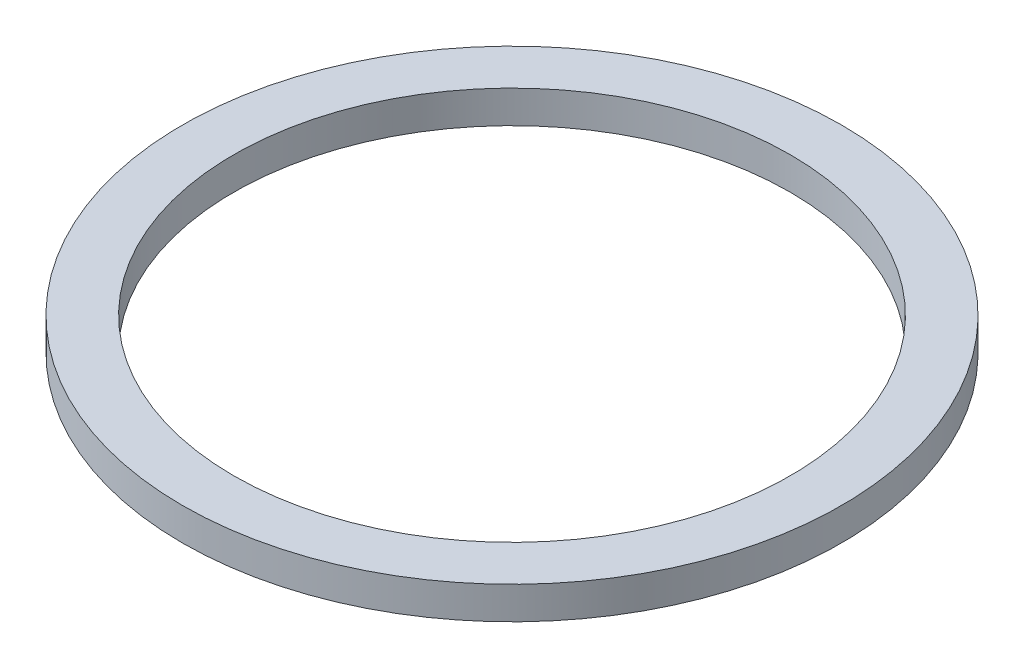
ISO-10303-21;
HEADER;
FILE_DESCRIPTION(('STEP AP214'),'2;1');
FILE_NAME('part.step','',(''),(''),'','','');
FILE_SCHEMA(('AUTOMOTIVE_DESIGN { 1 0 10303 214 1 1 1 1 }'));
ENDSEC;
DATA;
#1=APPLICATION_CONTEXT('core data for automotive mechanical design processes');
#2=APPLICATION_PROTOCOL_DEFINITION('international standard','automotive_design',2000,#1);
#3=PRODUCT_CONTEXT('',#1,'mechanical');
#4=PRODUCT('Part','Part','',(#3));
#5=PRODUCT_RELATED_PRODUCT_CATEGORY('part','',(#4));
#6=PRODUCT_DEFINITION_FORMATION('','',#4);
#7=PRODUCT_DEFINITION_CONTEXT('part definition',#1,'design');
#8=PRODUCT_DEFINITION('design','',#6,#7);
#9=PRODUCT_DEFINITION_SHAPE('','',#8);
#10=(LENGTH_UNIT() NAMED_UNIT(*) SI_UNIT(.MILLI.,.METRE.));
#11=(NAMED_UNIT(*) PLANE_ANGLE_UNIT() SI_UNIT($,.RADIAN.));
#12=(NAMED_UNIT(*) SI_UNIT($,.STERADIAN.) SOLID_ANGLE_UNIT());
#13=UNCERTAINTY_MEASURE_WITH_UNIT(LENGTH_MEASURE(1.E-05),#10,'distance_accuracy_value','');
#14=(GEOMETRIC_REPRESENTATION_CONTEXT(3) GLOBAL_UNCERTAINTY_ASSIGNED_CONTEXT((#13)) GLOBAL_UNIT_ASSIGNED_CONTEXT((#10,
#11,#12)) REPRESENTATION_CONTEXT('',''));
#15=CARTESIAN_POINT('',(0.,0.,0.));
#16=DIRECTION('',(0.,0.,1.));
#17=DIRECTION('',(1.,0.,0.));
#18=AXIS2_PLACEMENT_3D('',#15,#16,#17);
#19=CARTESIAN_POINT('',(0.,9.5,0.));
#20=DIRECTION('',(0.,1.,0.));
#21=DIRECTION('',(0.,0.,1.));
#22=AXIS2_PLACEMENT_3D('',#19,#20,#21);
#23=PLANE('',#22);
#24=CARTESIAN_POINT('',(0.,9.5,0.));
#25=DIRECTION('',(0.,1.,0.));
#26=DIRECTION('',(0.,0.,1.));
#27=AXIS2_PLACEMENT_3D('',#24,#25,#26);
#28=CIRCLE('',#27,192.5);
#29=CARTESIAN_POINT('',(0.,9.5,192.5));
#30=VERTEX_POINT('',#29);
#31=EDGE_CURVE('E10',#30,#30,#28,.T.);
#32=ORIENTED_EDGE('',*,*,#31,.T.);
#33=EDGE_LOOP('',(#32));
#34=FACE_BOUND('',#33,.T.);
#35=CARTESIAN_POINT('',(0.,9.5,0.));
#36=DIRECTION('',(0.,1.,0.));
#37=DIRECTION('',(0.,0.,1.));
#38=AXIS2_PLACEMENT_3D('',#35,#36,#37);
#39=CIRCLE('',#38,162.5);
#40=CARTESIAN_POINT('',(0.,9.5,162.5));
#41=VERTEX_POINT('',#40);
#42=EDGE_CURVE('E50',#41,#41,#39,.T.);
#43=ORIENTED_EDGE('',*,*,#42,.F.);
#44=EDGE_LOOP('',(#43));
#45=FACE_BOUND('',#44,.T.);
#46=ADVANCED_FACE('F37',(#34,#45),#23,.T.);
#47=CARTESIAN_POINT('',(0.,-9.5,0.));
#48=DIRECTION('',(0.,1.,0.));
#49=DIRECTION('',(0.,0.,1.));
#50=AXIS2_PLACEMENT_3D('',#47,#48,#49);
#51=PLANE('',#50);
#52=CARTESIAN_POINT('',(0.,-9.5,0.));
#53=DIRECTION('',(0.,1.,0.));
#54=DIRECTION('',(0.,0.,1.));
#55=AXIS2_PLACEMENT_3D('',#52,#53,#54);
#56=CIRCLE('',#55,192.5);
#57=CARTESIAN_POINT('',(0.,-9.5,192.5));
#58=VERTEX_POINT('',#57);
#59=EDGE_CURVE('E41',#58,#58,#56,.T.);
#60=ORIENTED_EDGE('',*,*,#59,.F.);
#61=EDGE_LOOP('',(#60));
#62=FACE_BOUND('',#61,.T.);
#63=CARTESIAN_POINT('',(0.,-9.5,0.));
#64=DIRECTION('',(0.,1.,0.));
#65=DIRECTION('',(0.,0.,1.));
#66=AXIS2_PLACEMENT_3D('',#63,#64,#65);
#67=CIRCLE('',#66,162.5);
#68=CARTESIAN_POINT('',(0.,-9.5,162.5));
#69=VERTEX_POINT('',#68);
#70=EDGE_CURVE('E52',#69,#69,#67,.T.);
#71=ORIENTED_EDGE('',*,*,#70,.T.);
#72=EDGE_LOOP('',(#71));
#73=FACE_BOUND('',#72,.T.);
#74=ADVANCED_FACE('F64',(#62,#73),#51,.F.);
#75=CARTESIAN_POINT('',(0.,9.5,0.));
#76=DIRECTION('',(0.,-1.,0.));
#77=DIRECTION('',(0.,0.,-1.));
#78=AXIS2_PLACEMENT_3D('',#75,#76,#77);
#79=CYLINDRICAL_SURFACE('',#78,192.5);
#80=ORIENTED_EDGE('',*,*,#31,.F.);
#81=EDGE_LOOP('',(#80));
#82=FACE_BOUND('',#81,.T.);
#83=ORIENTED_EDGE('',*,*,#59,.T.);
#84=EDGE_LOOP('',(#83));
#85=FACE_BOUND('',#84,.T.);
#86=ADVANCED_FACE('F39',(#82,#85),#79,.T.);
#87=CARTESIAN_POINT('',(0.,9.5,0.));
#88=DIRECTION('',(0.,-1.,0.));
#89=DIRECTION('',(0.,0.,-1.));
#90=AXIS2_PLACEMENT_3D('',#87,#88,#89);
#91=CYLINDRICAL_SURFACE('',#90,162.5);
#92=ORIENTED_EDGE('',*,*,#42,.T.);
#93=EDGE_LOOP('',(#92));
#94=FACE_BOUND('',#93,.T.);
#95=ORIENTED_EDGE('',*,*,#70,.F.);
#96=EDGE_LOOP('',(#95));
#97=FACE_BOUND('',#96,.T.);
#98=ADVANCED_FACE('F60',(#94,#97),#91,.F.);
#99=CLOSED_SHELL('',(#46,#74,#86,#98));
#100=MANIFOLD_SOLID_BREP('B2',#99);
#101=ADVANCED_BREP_SHAPE_REPRESENTATION('',(#18,#100),#14);
#102=SHAPE_DEFINITION_REPRESENTATION(#9,#101);
ENDSEC;
END-ISO-10303-21;
